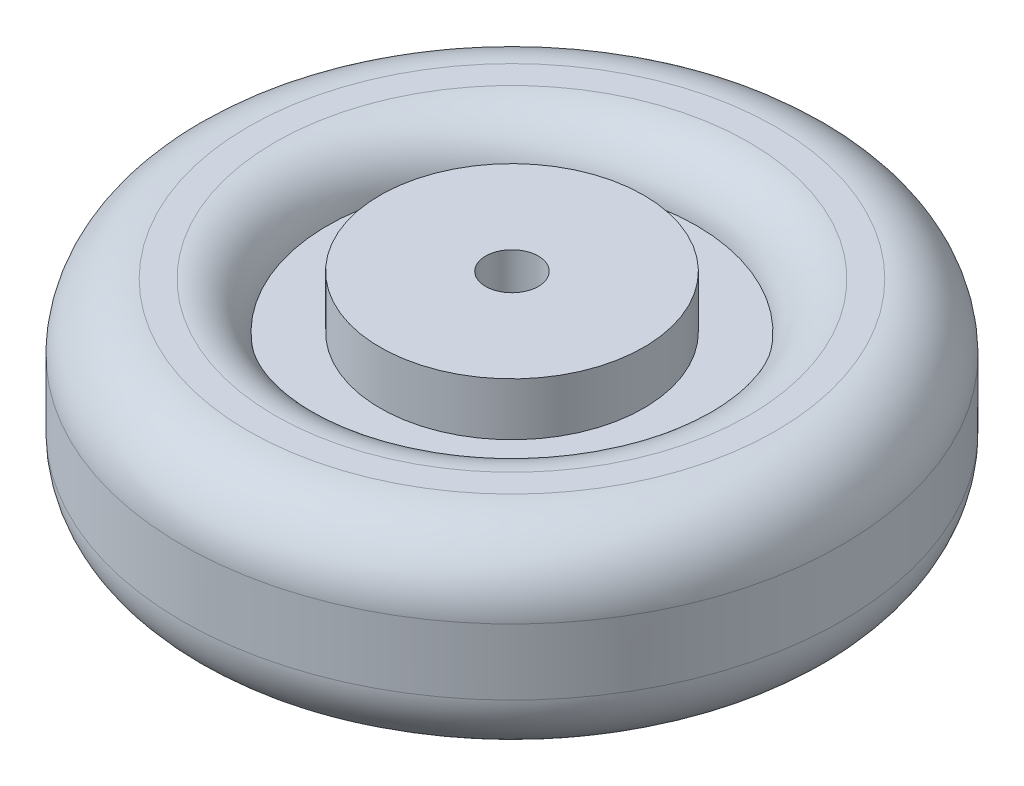
ISO-10303-21;
HEADER;
FILE_DESCRIPTION(('STEP AP214'),'2;1');
FILE_NAME('part.step','',(''),(''),'','','');
FILE_SCHEMA(('AUTOMOTIVE_DESIGN { 1 0 10303 214 1 1 1 1 }'));
ENDSEC;
DATA;
#1=APPLICATION_CONTEXT('core data for automotive mechanical design processes');
#2=APPLICATION_PROTOCOL_DEFINITION('international standard','automotive_design',2000,#1);
#3=PRODUCT_CONTEXT('',#1,'mechanical');
#4=PRODUCT('Part','Part','',(#3));
#5=PRODUCT_RELATED_PRODUCT_CATEGORY('part','',(#4));
#6=PRODUCT_DEFINITION_FORMATION('','',#4);
#7=PRODUCT_DEFINITION_CONTEXT('part definition',#1,'design');
#8=PRODUCT_DEFINITION('design','',#6,#7);
#9=PRODUCT_DEFINITION_SHAPE('','',#8);
#10=(LENGTH_UNIT() NAMED_UNIT(*) SI_UNIT(.MILLI.,.METRE.));
#11=(NAMED_UNIT(*) PLANE_ANGLE_UNIT() SI_UNIT($,.RADIAN.));
#12=(NAMED_UNIT(*) SI_UNIT($,.STERADIAN.) SOLID_ANGLE_UNIT());
#13=UNCERTAINTY_MEASURE_WITH_UNIT(LENGTH_MEASURE(1.E-05),#10,'distance_accuracy_value','');
#14=(GEOMETRIC_REPRESENTATION_CONTEXT(3) GLOBAL_UNCERTAINTY_ASSIGNED_CONTEXT((#13)) GLOBAL_UNIT_ASSIGNED_CONTEXT((#10,
#11,#12)) REPRESENTATION_CONTEXT('',''));
#15=CARTESIAN_POINT('',(0.,0.,0.));
#16=DIRECTION('',(0.,0.,1.));
#17=DIRECTION('',(1.,0.,0.));
#18=AXIS2_PLACEMENT_3D('',#15,#16,#17);
#19=CARTESIAN_POINT('',(-4.,16.,0.));
#20=DIRECTION('',(0.,-1.,0.));
#21=DIRECTION('',(0.,0.,-1.));
#22=AXIS2_PLACEMENT_3D('',#19,#20,#21);
#23=PLANE('',#22);
#24=CARTESIAN_POINT('',(0.,16.,0.));
#25=DIRECTION('',(0.,-1.,0.));
#26=DIRECTION('',(0.,0.,-1.));
#27=AXIS2_PLACEMENT_3D('',#24,#25,#26);
#28=CIRCLE('',#27,20.);
#29=CARTESIAN_POINT('',(0.,16.,-20.));
#30=VERTEX_POINT('',#29);
#31=EDGE_CURVE('E59',#30,#30,#28,.T.);
#32=ORIENTED_EDGE('',*,*,#31,.F.);
#33=EDGE_LOOP('',(#32));
#34=FACE_BOUND('',#33,.T.);
#35=CARTESIAN_POINT('',(0.,16.,0.));
#36=DIRECTION('',(0.,-1.,0.));
#37=DIRECTION('',(0.,0.,-1.));
#38=AXIS2_PLACEMENT_3D('',#35,#36,#37);
#39=CIRCLE('',#38,4.);
#40=CARTESIAN_POINT('',(0.,16.,-4.));
#41=VERTEX_POINT('',#40);
#42=EDGE_CURVE('E80',#41,#41,#39,.T.);
#43=ORIENTED_EDGE('',*,*,#42,.T.);
#44=EDGE_LOOP('',(#43));
#45=FACE_BOUND('',#44,.T.);
#46=ADVANCED_FACE('F33',(#34,#45),#23,.F.);
#47=CARTESIAN_POINT('',(0.,0.,0.));
#48=DIRECTION('',(0.,-1.,0.));
#49=DIRECTION('',(0.,0.,-1.));
#50=AXIS2_PLACEMENT_3D('',#47,#48,#49);
#51=CYLINDRICAL_SURFACE('',#50,20.);
#52=CARTESIAN_POINT('',(0.,8.,0.));
#53=DIRECTION('',(0.,-1.,0.));
#54=DIRECTION('',(0.,0.,-1.));
#55=AXIS2_PLACEMENT_3D('',#52,#53,#54);
#56=CIRCLE('',#55,20.);
#57=CARTESIAN_POINT('',(0.,8.,-20.));
#58=VERTEX_POINT('',#57);
#59=EDGE_CURVE('E62',#58,#58,#56,.T.);
#60=ORIENTED_EDGE('',*,*,#59,.F.);
#61=EDGE_LOOP('',(#60));
#62=FACE_BOUND('',#61,.T.);
#63=ORIENTED_EDGE('',*,*,#31,.T.);
#64=EDGE_LOOP('',(#63));
#65=FACE_BOUND('',#64,.T.);
#66=ADVANCED_FACE('F120',(#62,#65),#51,.T.);
#67=CARTESIAN_POINT('',(-20.,7.99999999999999,0.));
#68=DIRECTION('',(0.,-1.,0.));
#69=DIRECTION('',(0.,0.,-1.));
#70=AXIS2_PLACEMENT_3D('',#67,#68,#69);
#71=PLANE('',#70);
#72=CARTESIAN_POINT('',(0.,7.99999999999999,0.));
#73=DIRECTION('',(0.,-1.,0.));
#74=DIRECTION('',(0.,0.,-1.));
#75=AXIS2_PLACEMENT_3D('',#72,#73,#74);
#76=CIRCLE('',#75,28.);
#77=CARTESIAN_POINT('',(0.,7.99999999999999,-28.));
#78=VERTEX_POINT('',#77);
#79=EDGE_CURVE('E65',#78,#78,#76,.T.);
#80=ORIENTED_EDGE('',*,*,#79,.F.);
#81=EDGE_LOOP('',(#80));
#82=FACE_BOUND('',#81,.T.);
#83=ORIENTED_EDGE('',*,*,#59,.T.);
#84=EDGE_LOOP('',(#83));
#85=FACE_BOUND('',#84,.T.);
#86=ADVANCED_FACE('F126',(#82,#85),#71,.F.);
#87=CARTESIAN_POINT('',(-28.,15.,0.));
#88=DIRECTION('',(0.,-1.,0.));
#89=DIRECTION('',(0.,0.,-1.));
#90=AXIS2_PLACEMENT_3D('',#87,#88,#89);
#91=PLANE('',#90);
#92=CARTESIAN_POINT('',(0.,15.,0.));
#93=DIRECTION('',(0.,-1.,0.));
#94=DIRECTION('',(0.,0.,-1.));
#95=AXIS2_PLACEMENT_3D('',#92,#93,#94);
#96=CIRCLE('',#95,35.9372539331938);
#97=CARTESIAN_POINT('',(0.,15.,-35.9372539331938));
#98=VERTEX_POINT('',#97);
#99=EDGE_CURVE('E40',#98,#98,#96,.T.);
#100=ORIENTED_EDGE('',*,*,#99,.T.);
#101=EDGE_LOOP('',(#100));
#102=FACE_BOUND('',#101,.T.);
#103=CARTESIAN_POINT('',(0.,15.,0.));
#104=DIRECTION('',(0.,-1.,0.));
#105=DIRECTION('',(0.,0.,-1.));
#106=AXIS2_PLACEMENT_3D('',#103,#104,#105);
#107=CIRCLE('',#106,40.);
#108=CARTESIAN_POINT('',(0.,15.,-40.));
#109=VERTEX_POINT('',#108);
#110=EDGE_CURVE('E48',#109,#109,#107,.F.);
#111=ORIENTED_EDGE('',*,*,#110,.T.);
#112=EDGE_LOOP('',(#111));
#113=FACE_BOUND('',#112,.T.);
#114=ADVANCED_FACE('F149',(#102,#113),#91,.F.);
#115=CARTESIAN_POINT('',(0.,0.,0.));
#116=DIRECTION('',(0.,-1.,0.));
#117=DIRECTION('',(0.,0.,-1.));
#118=AXIS2_PLACEMENT_3D('',#115,#116,#117);
#119=CYLINDRICAL_SURFACE('',#118,50.);
#120=CARTESIAN_POINT('',(0.,5.,0.));
#121=DIRECTION('',(0.,-1.,0.));
#122=DIRECTION('',(0.,0.,-1.));
#123=AXIS2_PLACEMENT_3D('',#120,#121,#122);
#124=CIRCLE('',#123,50.);
#125=CARTESIAN_POINT('',(0.,5.,-50.));
#126=VERTEX_POINT('',#125);
#127=EDGE_CURVE('E53',#126,#126,#124,.T.);
#128=ORIENTED_EDGE('',*,*,#127,.T.);
#129=EDGE_LOOP('',(#128));
#130=FACE_BOUND('',#129,.T.);
#131=CARTESIAN_POINT('',(0.,-5.,0.));
#132=DIRECTION('',(0.,1.,0.));
#133=DIRECTION('',(0.,0.,1.));
#134=AXIS2_PLACEMENT_3D('',#131,#132,#133);
#135=CIRCLE('',#134,50.);
#136=CARTESIAN_POINT('',(0.,-5.,50.));
#137=VERTEX_POINT('',#136);
#138=EDGE_CURVE('E56',#137,#137,#135,.T.);
#139=ORIENTED_EDGE('',*,*,#138,.T.);
#140=EDGE_LOOP('',(#139));
#141=FACE_BOUND('',#140,.T.);
#142=ADVANCED_FACE('F144',(#130,#141),#119,.T.);
#143=CARTESIAN_POINT('',(-28.,-15.,0.));
#144=DIRECTION('',(0.,1.,0.));
#145=DIRECTION('',(0.,0.,1.));
#146=AXIS2_PLACEMENT_3D('',#143,#144,#145);
#147=PLANE('',#146);
#148=CARTESIAN_POINT('',(0.,-15.,0.));
#149=DIRECTION('',(0.,1.,0.));
#150=DIRECTION('',(0.,0.,1.));
#151=AXIS2_PLACEMENT_3D('',#148,#149,#150);
#152=CIRCLE('',#151,35.9372539331938);
#153=CARTESIAN_POINT('',(0.,-15.,35.9372539331938));
#154=VERTEX_POINT('',#153);
#155=EDGE_CURVE('E10',#154,#154,#152,.T.);
#156=ORIENTED_EDGE('',*,*,#155,.T.);
#157=EDGE_LOOP('',(#156));
#158=FACE_BOUND('',#157,.T.);
#159=CARTESIAN_POINT('',(0.,-15.,0.));
#160=DIRECTION('',(0.,1.,0.));
#161=DIRECTION('',(0.,0.,1.));
#162=AXIS2_PLACEMENT_3D('',#159,#160,#161);
#163=CIRCLE('',#162,40.);
#164=CARTESIAN_POINT('',(0.,-15.,40.));
#165=VERTEX_POINT('',#164);
#166=EDGE_CURVE('E44',#165,#165,#163,.F.);
#167=ORIENTED_EDGE('',*,*,#166,.T.);
#168=EDGE_LOOP('',(#167));
#169=FACE_BOUND('',#168,.T.);
#170=ADVANCED_FACE('F107',(#158,#169),#147,.F.);
#171=CARTESIAN_POINT('',(-20.,-7.99999999999999,0.));
#172=DIRECTION('',(0.,1.,0.));
#173=DIRECTION('',(0.,0.,1.));
#174=AXIS2_PLACEMENT_3D('',#171,#172,#173);
#175=PLANE('',#174);
#176=CARTESIAN_POINT('',(0.,-8.,0.));
#177=DIRECTION('',(0.,-1.,0.));
#178=DIRECTION('',(0.,0.,-1.));
#179=AXIS2_PLACEMENT_3D('',#176,#177,#178);
#180=CIRCLE('',#179,20.);
#181=CARTESIAN_POINT('',(0.,-8.,-20.));
#182=VERTEX_POINT('',#181);
#183=EDGE_CURVE('E71',#182,#182,#180,.T.);
#184=ORIENTED_EDGE('',*,*,#183,.F.);
#185=EDGE_LOOP('',(#184));
#186=FACE_BOUND('',#185,.T.);
#187=CARTESIAN_POINT('',(0.,-7.99999999999999,0.));
#188=DIRECTION('',(0.,-1.,0.));
#189=DIRECTION('',(0.,0.,-1.));
#190=AXIS2_PLACEMENT_3D('',#187,#188,#189);
#191=CIRCLE('',#190,28.);
#192=CARTESIAN_POINT('',(0.,-7.99999999999999,-28.));
#193=VERTEX_POINT('',#192);
#194=EDGE_CURVE('E68',#193,#193,#191,.T.);
#195=ORIENTED_EDGE('',*,*,#194,.T.);
#196=EDGE_LOOP('',(#195));
#197=FACE_BOUND('',#196,.T.);
#198=ADVANCED_FACE('F101',(#186,#197),#175,.F.);
#199=CARTESIAN_POINT('',(0.,0.,0.));
#200=DIRECTION('',(0.,-1.,0.));
#201=DIRECTION('',(0.,0.,-1.));
#202=AXIS2_PLACEMENT_3D('',#199,#200,#201);
#203=CYLINDRICAL_SURFACE('',#202,20.);
#204=CARTESIAN_POINT('',(0.,-16.,0.));
#205=DIRECTION('',(0.,-1.,0.));
#206=DIRECTION('',(0.,0.,-1.));
#207=AXIS2_PLACEMENT_3D('',#204,#205,#206);
#208=CIRCLE('',#207,20.);
#209=CARTESIAN_POINT('',(0.,-16.,-20.));
#210=VERTEX_POINT('',#209);
#211=EDGE_CURVE('E74',#210,#210,#208,.T.);
#212=ORIENTED_EDGE('',*,*,#211,.F.);
#213=EDGE_LOOP('',(#212));
#214=FACE_BOUND('',#213,.T.);
#215=ORIENTED_EDGE('',*,*,#183,.T.);
#216=EDGE_LOOP('',(#215));
#217=FACE_BOUND('',#216,.T.);
#218=ADVANCED_FACE('F95',(#214,#217),#203,.T.);
#219=CARTESIAN_POINT('',(-4.,-16.,0.));
#220=DIRECTION('',(0.,1.,0.));
#221=DIRECTION('',(0.,0.,1.));
#222=AXIS2_PLACEMENT_3D('',#219,#220,#221);
#223=PLANE('',#222);
#224=CARTESIAN_POINT('',(0.,-16.,0.));
#225=DIRECTION('',(0.,-1.,0.));
#226=DIRECTION('',(0.,0.,-1.));
#227=AXIS2_PLACEMENT_3D('',#224,#225,#226);
#228=CIRCLE('',#227,4.);
#229=CARTESIAN_POINT('',(0.,-16.,-4.));
#230=VERTEX_POINT('',#229);
#231=EDGE_CURVE('E77',#230,#230,#228,.T.);
#232=ORIENTED_EDGE('',*,*,#231,.F.);
#233=EDGE_LOOP('',(#232));
#234=FACE_BOUND('',#233,.T.);
#235=ORIENTED_EDGE('',*,*,#211,.T.);
#236=EDGE_LOOP('',(#235));
#237=FACE_BOUND('',#236,.T.);
#238=ADVANCED_FACE('F89',(#234,#237),#223,.F.);
#239=CARTESIAN_POINT('',(0.,0.,0.));
#240=DIRECTION('',(0.,-1.,0.));
#241=DIRECTION('',(0.,0.,-1.));
#242=AXIS2_PLACEMENT_3D('',#239,#240,#241);
#243=CYLINDRICAL_SURFACE('',#242,4.);
#244=ORIENTED_EDGE('',*,*,#42,.F.);
#245=EDGE_LOOP('',(#244));
#246=FACE_BOUND('',#245,.T.);
#247=ORIENTED_EDGE('',*,*,#231,.T.);
#248=EDGE_LOOP('',(#247));
#249=FACE_BOUND('',#248,.T.);
#250=ADVANCED_FACE('F85',(#246,#249),#243,.F.);
#251=CARTESIAN_POINT('',(0.,5.,0.));
#252=DIRECTION('',(0.,-1.,0.));
#253=DIRECTION('',(0.,0.,-1.));
#254=AXIS2_PLACEMENT_3D('',#251,#252,#253);
#255=TOROIDAL_SURFACE('',#254,40.,10.);
#256=ORIENTED_EDGE('',*,*,#110,.F.);
#257=EDGE_LOOP('',(#256));
#258=FACE_BOUND('',#257,.T.);
#259=ORIENTED_EDGE('',*,*,#127,.F.);
#260=EDGE_LOOP('',(#259));
#261=FACE_BOUND('',#260,.T.);
#262=ADVANCED_FACE('F88',(#258,#261),#255,.T.);
#263=CARTESIAN_POINT('',(0.,-5.,0.));
#264=DIRECTION('',(0.,1.,0.));
#265=DIRECTION('',(0.,0.,1.));
#266=AXIS2_PLACEMENT_3D('',#263,#264,#265);
#267=TOROIDAL_SURFACE('',#266,40.,10.);
#268=ORIENTED_EDGE('',*,*,#138,.F.);
#269=EDGE_LOOP('',(#268));
#270=FACE_BOUND('',#269,.T.);
#271=ORIENTED_EDGE('',*,*,#166,.F.);
#272=EDGE_LOOP('',(#271));
#273=FACE_BOUND('',#272,.T.);
#274=ADVANCED_FACE('F117',(#270,#273),#267,.T.);
#275=CARTESIAN_POINT('',(0.,7.,0.));
#276=DIRECTION('',(0.,-1.,0.));
#277=DIRECTION('',(0.,0.,-1.));
#278=AXIS2_PLACEMENT_3D('',#275,#276,#277);
#279=TOROIDAL_SURFACE('',#278,35.9372539331938,8.);
#280=ORIENTED_EDGE('',*,*,#79,.T.);
#281=EDGE_LOOP('',(#280));
#282=FACE_BOUND('',#281,.T.);
#283=ORIENTED_EDGE('',*,*,#99,.F.);
#284=EDGE_LOOP('',(#283));
#285=FACE_BOUND('',#284,.T.);
#286=ADVANCED_FACE('F112',(#282,#285),#279,.T.);
#287=CARTESIAN_POINT('',(0.,-7.,0.));
#288=DIRECTION('',(0.,1.,0.));
#289=DIRECTION('',(0.,0.,1.));
#290=AXIS2_PLACEMENT_3D('',#287,#288,#289);
#291=TOROIDAL_SURFACE('',#290,35.9372539331938,8.);
#292=ORIENTED_EDGE('',*,*,#155,.F.);
#293=EDGE_LOOP('',(#292));
#294=FACE_BOUND('',#293,.T.);
#295=ORIENTED_EDGE('',*,*,#194,.F.);
#296=EDGE_LOOP('',(#295));
#297=FACE_BOUND('',#296,.T.);
#298=ADVANCED_FACE('F35',(#294,#297),#291,.T.);
#299=CLOSED_SHELL('',(#46,#66,#86,#114,#142,#170,#198,#218,#238,#250,#262,#274,#286,#298));
#300=MANIFOLD_SOLID_BREP('B2',#299);
#301=ADVANCED_BREP_SHAPE_REPRESENTATION('',(#18,#300),#14);
#302=SHAPE_DEFINITION_REPRESENTATION(#9,#301);
ENDSEC;
END-ISO-10303-21;
